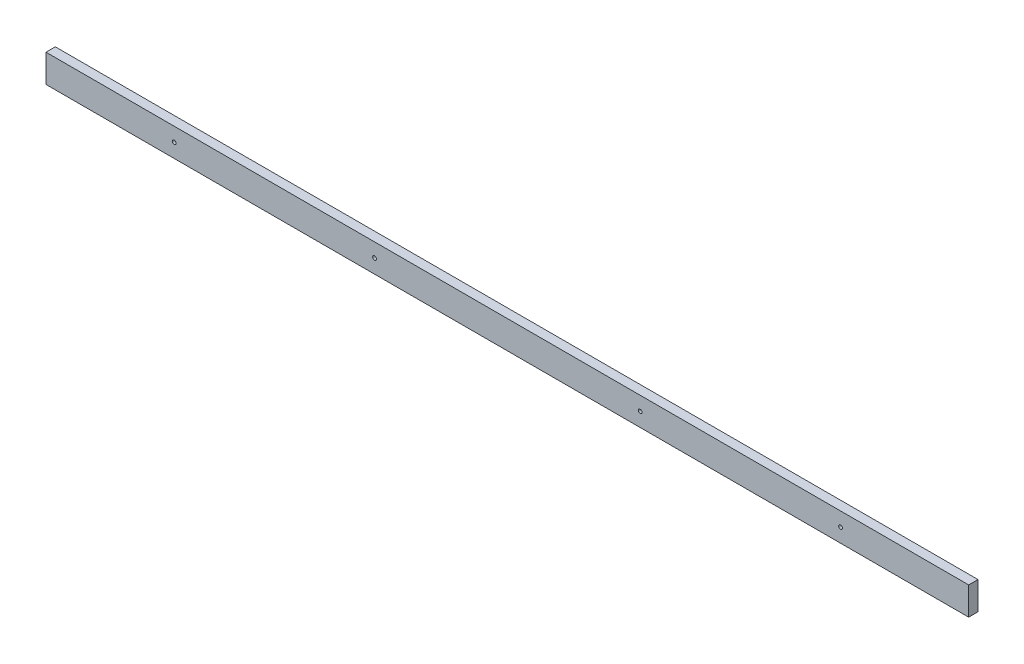
ISO-10303-21;
HEADER;
FILE_DESCRIPTION(('STEP AP214'),'2;1');
FILE_NAME('part.step','',(''),(''),'','','');
FILE_SCHEMA(('AUTOMOTIVE_DESIGN { 1 0 10303 214 1 1 1 1 }'));
ENDSEC;
DATA;
#1=APPLICATION_CONTEXT('core data for automotive mechanical design processes');
#2=APPLICATION_PROTOCOL_DEFINITION('international standard','automotive_design',2000,#1);
#3=PRODUCT_CONTEXT('',#1,'mechanical');
#4=PRODUCT('Part','Part','',(#3));
#5=PRODUCT_RELATED_PRODUCT_CATEGORY('part','',(#4));
#6=PRODUCT_DEFINITION_FORMATION('','',#4);
#7=PRODUCT_DEFINITION_CONTEXT('part definition',#1,'design');
#8=PRODUCT_DEFINITION('design','',#6,#7);
#9=PRODUCT_DEFINITION_SHAPE('','',#8);
#10=(LENGTH_UNIT() NAMED_UNIT(*) SI_UNIT(.MILLI.,.METRE.));
#11=(NAMED_UNIT(*) PLANE_ANGLE_UNIT() SI_UNIT($,.RADIAN.));
#12=(NAMED_UNIT(*) SI_UNIT($,.STERADIAN.) SOLID_ANGLE_UNIT());
#13=UNCERTAINTY_MEASURE_WITH_UNIT(LENGTH_MEASURE(1.E-05),#10,'distance_accuracy_value','');
#14=(GEOMETRIC_REPRESENTATION_CONTEXT(3) GLOBAL_UNCERTAINTY_ASSIGNED_CONTEXT((#13)) GLOBAL_UNIT_ASSIGNED_CONTEXT((#10,
#11,#12)) REPRESENTATION_CONTEXT('',''));
#15=CARTESIAN_POINT('',(0.,0.,0.));
#16=DIRECTION('',(0.,0.,1.));
#17=DIRECTION('',(1.,0.,0.));
#18=AXIS2_PLACEMENT_3D('',#15,#16,#17);
#19=CARTESIAN_POINT('',(990.,30.,10.));
#20=DIRECTION('',(-1.,0.,0.));
#21=DIRECTION('',(0.,0.,1.));
#22=AXIS2_PLACEMENT_3D('',#19,#20,#21);
#23=PLANE('',#22);
#24=DIRECTION('',(0.,1.,0.));
#25=VECTOR('',#24,1.);
#26=CARTESIAN_POINT('',(990.,30.,-10.));
#27=LINE('',#26,#25);
#28=CARTESIAN_POINT('',(990.,-30.,-10.));
#29=VERTEX_POINT('',#28);
#30=CARTESIAN_POINT('',(990.,30.,-10.));
#31=VERTEX_POINT('',#30);
#32=EDGE_CURVE('E97',#29,#31,#27,.T.);
#33=ORIENTED_EDGE('',*,*,#32,.T.);
#34=DIRECTION('',(0.,0.,-1.));
#35=VECTOR('',#34,1.);
#36=CARTESIAN_POINT('',(990.,30.,10.));
#37=LINE('',#36,#35);
#38=CARTESIAN_POINT('',(990.,30.,10.));
#39=VERTEX_POINT('',#38);
#40=EDGE_CURVE('E11',#39,#31,#37,.T.);
#41=ORIENTED_EDGE('',*,*,#40,.F.);
#42=DIRECTION('',(0.,1.,0.));
#43=VECTOR('',#42,1.);
#44=CARTESIAN_POINT('',(990.,30.,10.));
#45=LINE('',#44,#43);
#46=CARTESIAN_POINT('',(990.,-30.,10.));
#47=VERTEX_POINT('',#46);
#48=EDGE_CURVE('E85',#47,#39,#45,.T.);
#49=ORIENTED_EDGE('',*,*,#48,.F.);
#50=DIRECTION('',(0.,0.,-1.));
#51=VECTOR('',#50,1.);
#52=CARTESIAN_POINT('',(990.,-30.,10.));
#53=LINE('',#52,#51);
#54=EDGE_CURVE('E93',#47,#29,#53,.T.);
#55=ORIENTED_EDGE('',*,*,#54,.T.);
#56=EDGE_LOOP('',(#33,#41,#49,#55));
#57=FACE_BOUND('',#56,.T.);
#58=ADVANCED_FACE('F34',(#57),#23,.F.);
#59=CARTESIAN_POINT('',(-990.,30.,10.));
#60=DIRECTION('',(0.,-1.,0.));
#61=DIRECTION('',(0.,0.,-1.));
#62=AXIS2_PLACEMENT_3D('',#59,#60,#61);
#63=PLANE('',#62);
#64=DIRECTION('',(-1.,0.,0.));
#65=VECTOR('',#64,1.);
#66=CARTESIAN_POINT('',(-990.,30.,-10.));
#67=LINE('',#66,#65);
#68=CARTESIAN_POINT('',(-990.,30.,-10.));
#69=VERTEX_POINT('',#68);
#70=EDGE_CURVE('E89',#31,#69,#67,.T.);
#71=ORIENTED_EDGE('',*,*,#70,.T.);
#72=DIRECTION('',(0.,0.,-1.));
#73=VECTOR('',#72,1.);
#74=CARTESIAN_POINT('',(-990.,30.,10.));
#75=LINE('',#74,#73);
#76=CARTESIAN_POINT('',(-990.,30.,10.));
#77=VERTEX_POINT('',#76);
#78=EDGE_CURVE('E42',#77,#69,#75,.T.);
#79=ORIENTED_EDGE('',*,*,#78,.F.);
#80=DIRECTION('',(-1.,0.,0.));
#81=VECTOR('',#80,1.);
#82=CARTESIAN_POINT('',(-990.,30.,10.));
#83=LINE('',#82,#81);
#84=EDGE_CURVE('E80',#39,#77,#83,.T.);
#85=ORIENTED_EDGE('',*,*,#84,.F.);
#86=ORIENTED_EDGE('',*,*,#40,.T.);
#87=EDGE_LOOP('',(#71,#79,#85,#86));
#88=FACE_BOUND('',#87,.T.);
#89=ADVANCED_FACE('F88',(#88),#63,.F.);
#90=CARTESIAN_POINT('',(-990.,30.,10.));
#91=DIRECTION('',(1.,0.,0.));
#92=DIRECTION('',(0.,0.,-1.));
#93=AXIS2_PLACEMENT_3D('',#90,#91,#92);
#94=PLANE('',#93);
#95=DIRECTION('',(0.,-1.,0.));
#96=VECTOR('',#95,1.);
#97=CARTESIAN_POINT('',(-990.,30.,-10.));
#98=LINE('',#97,#96);
#99=CARTESIAN_POINT('',(-990.,-30.,-10.));
#100=VERTEX_POINT('',#99);
#101=EDGE_CURVE('E67',#69,#100,#98,.T.);
#102=ORIENTED_EDGE('',*,*,#101,.T.);
#103=DIRECTION('',(0.,0.,-1.));
#104=VECTOR('',#103,1.);
#105=CARTESIAN_POINT('',(-990.,-30.,10.));
#106=LINE('',#105,#104);
#107=CARTESIAN_POINT('',(-990.,-30.,10.));
#108=VERTEX_POINT('',#107);
#109=EDGE_CURVE('E90',#108,#100,#106,.T.);
#110=ORIENTED_EDGE('',*,*,#109,.F.);
#111=DIRECTION('',(0.,-1.,0.));
#112=VECTOR('',#111,1.);
#113=CARTESIAN_POINT('',(-990.,30.,10.));
#114=LINE('',#113,#112);
#115=EDGE_CURVE('E83',#77,#108,#114,.T.);
#116=ORIENTED_EDGE('',*,*,#115,.F.);
#117=ORIENTED_EDGE('',*,*,#78,.T.);
#118=EDGE_LOOP('',(#102,#110,#116,#117));
#119=FACE_BOUND('',#118,.T.);
#120=ADVANCED_FACE('F91',(#119),#94,.F.);
#121=CARTESIAN_POINT('',(-990.,-30.,10.));
#122=DIRECTION('',(0.,1.,0.));
#123=DIRECTION('',(0.,0.,1.));
#124=AXIS2_PLACEMENT_3D('',#121,#122,#123);
#125=PLANE('',#124);
#126=DIRECTION('',(1.,0.,0.));
#127=VECTOR('',#126,1.);
#128=CARTESIAN_POINT('',(-990.,-30.,-10.));
#129=LINE('',#128,#127);
#130=EDGE_CURVE('E73',#100,#29,#129,.T.);
#131=ORIENTED_EDGE('',*,*,#130,.T.);
#132=ORIENTED_EDGE('',*,*,#54,.F.);
#133=DIRECTION('',(1.,0.,0.));
#134=VECTOR('',#133,1.);
#135=CARTESIAN_POINT('',(-990.,-30.,10.));
#136=LINE('',#135,#134);
#137=EDGE_CURVE('E50',#108,#47,#136,.T.);
#138=ORIENTED_EDGE('',*,*,#137,.F.);
#139=ORIENTED_EDGE('',*,*,#109,.T.);
#140=EDGE_LOOP('',(#131,#132,#138,#139));
#141=FACE_BOUND('',#140,.T.);
#142=ADVANCED_FACE('F105',(#141),#125,.F.);
#143=CARTESIAN_POINT('',(0.,0.,10.));
#144=DIRECTION('',(0.,0.,1.));
#145=DIRECTION('',(1.,0.,0.));
#146=AXIS2_PLACEMENT_3D('',#143,#144,#145);
#147=PLANE('',#146);
#148=CARTESIAN_POINT('',(-715.,0.,10.));
#149=DIRECTION('',(0.,0.,1.));
#150=DIRECTION('',(1.,0.,0.));
#151=AXIS2_PLACEMENT_3D('',#148,#149,#150);
#152=CIRCLE('',#151,3.99999999999999);
#153=CARTESIAN_POINT('',(-711.,0.,10.));
#154=VERTEX_POINT('',#153);
#155=EDGE_CURVE('E127',#154,#154,#152,.T.);
#156=ORIENTED_EDGE('',*,*,#155,.F.);
#157=EDGE_LOOP('',(#156));
#158=FACE_BOUND('',#157,.T.);
#159=CARTESIAN_POINT('',(-285.,0.,10.));
#160=DIRECTION('',(0.,0.,1.));
#161=DIRECTION('',(1.,0.,0.));
#162=AXIS2_PLACEMENT_3D('',#159,#160,#161);
#163=CIRCLE('',#162,3.99999999999999);
#164=CARTESIAN_POINT('',(-281.,0.,10.));
#165=VERTEX_POINT('',#164);
#166=EDGE_CURVE('E121',#165,#165,#163,.T.);
#167=ORIENTED_EDGE('',*,*,#166,.F.);
#168=EDGE_LOOP('',(#167));
#169=FACE_BOUND('',#168,.T.);
#170=CARTESIAN_POINT('',(285.,0.,10.));
#171=DIRECTION('',(0.,0.,1.));
#172=DIRECTION('',(-1.,0.,0.));
#173=AXIS2_PLACEMENT_3D('',#170,#171,#172);
#174=CIRCLE('',#173,3.99999999999999);
#175=CARTESIAN_POINT('',(281.,0.,10.));
#176=VERTEX_POINT('',#175);
#177=EDGE_CURVE('E114',#176,#176,#174,.T.);
#178=ORIENTED_EDGE('',*,*,#177,.F.);
#179=EDGE_LOOP('',(#178));
#180=FACE_BOUND('',#179,.T.);
#181=CARTESIAN_POINT('',(715.,0.,10.));
#182=DIRECTION('',(0.,0.,1.));
#183=DIRECTION('',(-1.,0.,0.));
#184=AXIS2_PLACEMENT_3D('',#181,#182,#183);
#185=CIRCLE('',#184,3.99999999999999);
#186=CARTESIAN_POINT('',(711.,0.,10.));
#187=VERTEX_POINT('',#186);
#188=EDGE_CURVE('E115',#187,#187,#185,.T.);
#189=ORIENTED_EDGE('',*,*,#188,.F.);
#190=EDGE_LOOP('',(#189));
#191=FACE_BOUND('',#190,.T.);
#192=ORIENTED_EDGE('',*,*,#48,.T.);
#193=ORIENTED_EDGE('',*,*,#84,.T.);
#194=ORIENTED_EDGE('',*,*,#115,.T.);
#195=ORIENTED_EDGE('',*,*,#137,.T.);
#196=EDGE_LOOP('',(#192,#193,#194,#195));
#197=FACE_BOUND('',#196,.T.);
#198=ADVANCED_FACE('F81',(#158,#169,#180,#191,#197),#147,.T.);
#199=CARTESIAN_POINT('',(0.,0.,-10.));
#200=DIRECTION('',(0.,0.,1.));
#201=DIRECTION('',(1.,0.,0.));
#202=AXIS2_PLACEMENT_3D('',#199,#200,#201);
#203=PLANE('',#202);
#204=CARTESIAN_POINT('',(-715.,0.,-10.));
#205=DIRECTION('',(0.,0.,1.));
#206=DIRECTION('',(1.,0.,0.));
#207=AXIS2_PLACEMENT_3D('',#204,#205,#206);
#208=CIRCLE('',#207,3.99999999999999);
#209=CARTESIAN_POINT('',(-711.,0.,-10.));
#210=VERTEX_POINT('',#209);
#211=EDGE_CURVE('E100',#210,#210,#208,.T.);
#212=ORIENTED_EDGE('',*,*,#211,.T.);
#213=EDGE_LOOP('',(#212));
#214=FACE_BOUND('',#213,.T.);
#215=CARTESIAN_POINT('',(-285.,0.,-10.));
#216=DIRECTION('',(0.,0.,1.));
#217=DIRECTION('',(1.,0.,0.));
#218=AXIS2_PLACEMENT_3D('',#215,#216,#217);
#219=CIRCLE('',#218,3.99999999999999);
#220=CARTESIAN_POINT('',(-281.,0.,-10.));
#221=VERTEX_POINT('',#220);
#222=EDGE_CURVE('E124',#221,#221,#219,.T.);
#223=ORIENTED_EDGE('',*,*,#222,.T.);
#224=EDGE_LOOP('',(#223));
#225=FACE_BOUND('',#224,.T.);
#226=CARTESIAN_POINT('',(285.,0.,-10.));
#227=DIRECTION('',(0.,0.,1.));
#228=DIRECTION('',(-1.,0.,0.));
#229=AXIS2_PLACEMENT_3D('',#226,#227,#228);
#230=CIRCLE('',#229,3.99999999999999);
#231=CARTESIAN_POINT('',(281.,0.,-10.));
#232=VERTEX_POINT('',#231);
#233=EDGE_CURVE('E118',#232,#232,#230,.T.);
#234=ORIENTED_EDGE('',*,*,#233,.T.);
#235=EDGE_LOOP('',(#234));
#236=FACE_BOUND('',#235,.T.);
#237=CARTESIAN_POINT('',(715.,0.,-10.));
#238=DIRECTION('',(0.,0.,1.));
#239=DIRECTION('',(-1.,0.,0.));
#240=AXIS2_PLACEMENT_3D('',#237,#238,#239);
#241=CIRCLE('',#240,3.99999999999999);
#242=CARTESIAN_POINT('',(711.,0.,-10.));
#243=VERTEX_POINT('',#242);
#244=EDGE_CURVE('E111',#243,#243,#241,.T.);
#245=ORIENTED_EDGE('',*,*,#244,.T.);
#246=EDGE_LOOP('',(#245));
#247=FACE_BOUND('',#246,.T.);
#248=ORIENTED_EDGE('',*,*,#32,.F.);
#249=ORIENTED_EDGE('',*,*,#130,.F.);
#250=ORIENTED_EDGE('',*,*,#101,.F.);
#251=ORIENTED_EDGE('',*,*,#70,.F.);
#252=EDGE_LOOP('',(#248,#249,#250,#251));
#253=FACE_BOUND('',#252,.T.);
#254=ADVANCED_FACE('F108',(#214,#225,#236,#247,#253),#203,.F.);
#255=CARTESIAN_POINT('',(715.,0.,-10.));
#256=DIRECTION('',(0.,0.,1.));
#257=DIRECTION('',(1.,0.,0.));
#258=AXIS2_PLACEMENT_3D('',#255,#256,#257);
#259=CYLINDRICAL_SURFACE('',#258,3.99999999999999);
#260=ORIENTED_EDGE('',*,*,#244,.F.);
#261=EDGE_LOOP('',(#260));
#262=FACE_BOUND('',#261,.T.);
#263=ORIENTED_EDGE('',*,*,#188,.T.);
#264=EDGE_LOOP('',(#263));
#265=FACE_BOUND('',#264,.T.);
#266=ADVANCED_FACE('F146',(#262,#265),#259,.F.);
#267=CARTESIAN_POINT('',(285.,0.,-10.));
#268=DIRECTION('',(0.,0.,1.));
#269=DIRECTION('',(1.,0.,0.));
#270=AXIS2_PLACEMENT_3D('',#267,#268,#269);
#271=CYLINDRICAL_SURFACE('',#270,3.99999999999999);
#272=ORIENTED_EDGE('',*,*,#233,.F.);
#273=EDGE_LOOP('',(#272));
#274=FACE_BOUND('',#273,.T.);
#275=ORIENTED_EDGE('',*,*,#177,.T.);
#276=EDGE_LOOP('',(#275));
#277=FACE_BOUND('',#276,.T.);
#278=ADVANCED_FACE('F148',(#274,#277),#271,.F.);
#279=CARTESIAN_POINT('',(-285.,0.,-10.));
#280=DIRECTION('',(0.,0.,1.));
#281=DIRECTION('',(1.,0.,0.));
#282=AXIS2_PLACEMENT_3D('',#279,#280,#281);
#283=CYLINDRICAL_SURFACE('',#282,3.99999999999999);
#284=ORIENTED_EDGE('',*,*,#222,.F.);
#285=EDGE_LOOP('',(#284));
#286=FACE_BOUND('',#285,.T.);
#287=ORIENTED_EDGE('',*,*,#166,.T.);
#288=EDGE_LOOP('',(#287));
#289=FACE_BOUND('',#288,.T.);
#290=ADVANCED_FACE('F155',(#286,#289),#283,.F.);
#291=CARTESIAN_POINT('',(-715.,0.,-10.));
#292=DIRECTION('',(0.,0.,1.));
#293=DIRECTION('',(1.,0.,0.));
#294=AXIS2_PLACEMENT_3D('',#291,#292,#293);
#295=CYLINDRICAL_SURFACE('',#294,3.99999999999999);
#296=ORIENTED_EDGE('',*,*,#211,.F.);
#297=EDGE_LOOP('',(#296));
#298=FACE_BOUND('',#297,.T.);
#299=ORIENTED_EDGE('',*,*,#155,.T.);
#300=EDGE_LOOP('',(#299));
#301=FACE_BOUND('',#300,.T.);
#302=ADVANCED_FACE('F135',(#298,#301),#295,.F.);
#303=CLOSED_SHELL('',(#58,#89,#120,#142,#198,#254,#266,#278,#290,#302));
#304=MANIFOLD_SOLID_BREP('B2',#303);
#305=ADVANCED_BREP_SHAPE_REPRESENTATION('',(#18,#304),#14);
#306=SHAPE_DEFINITION_REPRESENTATION(#9,#305);
ENDSEC;
END-ISO-10303-21;
